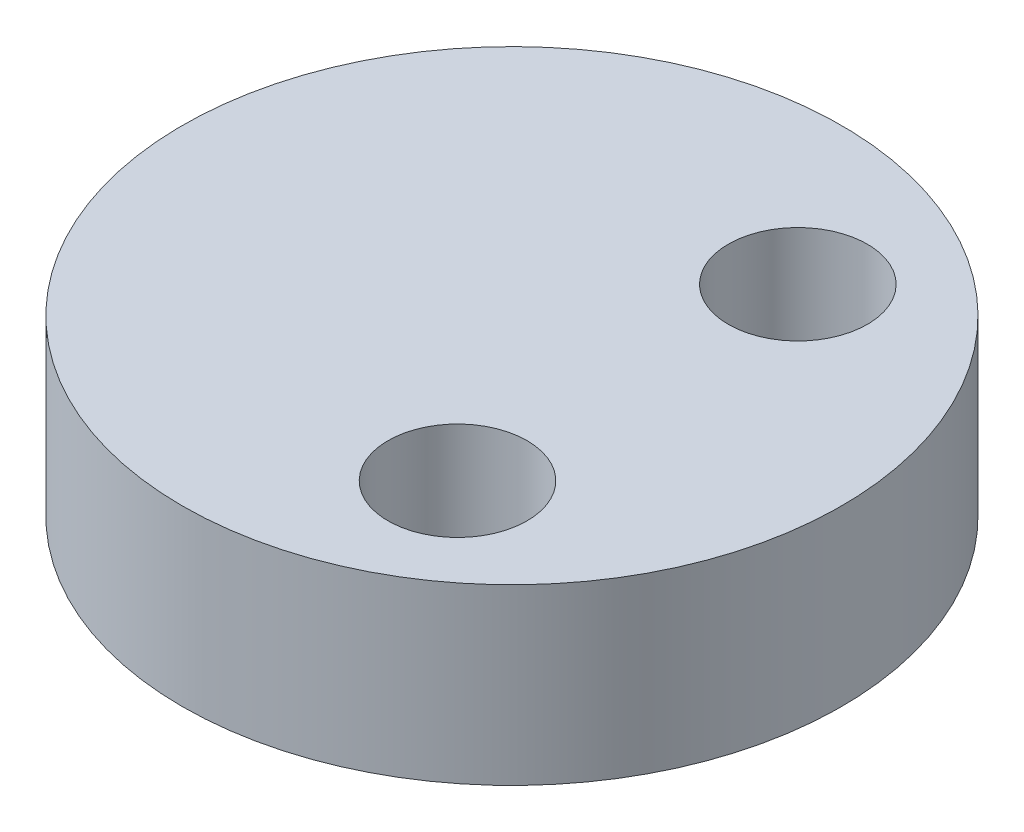
ISO-10303-21;
HEADER;
FILE_DESCRIPTION(('STEP AP214'),'2;1');
FILE_NAME('part.step','',(''),(''),'','','');
FILE_SCHEMA(('AUTOMOTIVE_DESIGN { 1 0 10303 214 1 1 1 1 }'));
ENDSEC;
DATA;
#1=APPLICATION_CONTEXT('core data for automotive mechanical design processes');
#2=APPLICATION_PROTOCOL_DEFINITION('international standard','automotive_design',2000,#1);
#3=PRODUCT_CONTEXT('',#1,'mechanical');
#4=PRODUCT('Part','Part','',(#3));
#5=PRODUCT_RELATED_PRODUCT_CATEGORY('part','',(#4));
#6=PRODUCT_DEFINITION_FORMATION('','',#4);
#7=PRODUCT_DEFINITION_CONTEXT('part definition',#1,'design');
#8=PRODUCT_DEFINITION('design','',#6,#7);
#9=PRODUCT_DEFINITION_SHAPE('','',#8);
#10=(LENGTH_UNIT() NAMED_UNIT(*) SI_UNIT(.MILLI.,.METRE.));
#11=(NAMED_UNIT(*) PLANE_ANGLE_UNIT() SI_UNIT($,.RADIAN.));
#12=(NAMED_UNIT(*) SI_UNIT($,.STERADIAN.) SOLID_ANGLE_UNIT());
#13=UNCERTAINTY_MEASURE_WITH_UNIT(LENGTH_MEASURE(1.E-05),#10,'distance_accuracy_value','');
#14=(GEOMETRIC_REPRESENTATION_CONTEXT(3) GLOBAL_UNCERTAINTY_ASSIGNED_CONTEXT((#13)) GLOBAL_UNIT_ASSIGNED_CONTEXT((#10,
#11,#12)) REPRESENTATION_CONTEXT('',''));
#15=CARTESIAN_POINT('',(0.,0.,0.));
#16=DIRECTION('',(0.,0.,1.));
#17=DIRECTION('',(1.,0.,0.));
#18=AXIS2_PLACEMENT_3D('',#15,#16,#17);
#19=CARTESIAN_POINT('',(0.,-5.,0.));
#20=DIRECTION('',(0.,1.,0.));
#21=DIRECTION('',(0.,0.,1.));
#22=AXIS2_PLACEMENT_3D('',#19,#20,#21);
#23=CYLINDRICAL_SURFACE('',#22,9.48);
#24=CARTESIAN_POINT('',(0.,-5.,0.));
#25=DIRECTION('',(0.,1.,0.));
#26=DIRECTION('',(0.,0.,1.));
#27=AXIS2_PLACEMENT_3D('',#24,#25,#26);
#28=CIRCLE('',#27,9.48);
#29=CARTESIAN_POINT('',(0.,-5.,9.48));
#30=VERTEX_POINT('',#29);
#31=EDGE_CURVE('E10',#30,#30,#28,.T.);
#32=ORIENTED_EDGE('',*,*,#31,.T.);
#33=EDGE_LOOP('',(#32));
#34=FACE_BOUND('',#33,.T.);
#35=CARTESIAN_POINT('',(0.,0.,0.));
#36=DIRECTION('',(0.,1.,0.));
#37=DIRECTION('',(0.,0.,1.));
#38=AXIS2_PLACEMENT_3D('',#35,#36,#37);
#39=CIRCLE('',#38,9.48);
#40=CARTESIAN_POINT('',(0.,0.,9.48));
#41=VERTEX_POINT('',#40);
#42=EDGE_CURVE('E35',#41,#41,#39,.T.);
#43=ORIENTED_EDGE('',*,*,#42,.F.);
#44=EDGE_LOOP('',(#43));
#45=FACE_BOUND('',#44,.T.);
#46=ADVANCED_FACE('F32',(#34,#45),#23,.T.);
#47=CARTESIAN_POINT('',(0.,-5.,0.));
#48=DIRECTION('',(0.,1.,0.));
#49=DIRECTION('',(0.,0.,1.));
#50=AXIS2_PLACEMENT_3D('',#47,#48,#49);
#51=PLANE('',#50);
#52=ORIENTED_EDGE('',*,*,#31,.F.);
#53=EDGE_LOOP('',(#52));
#54=FACE_BOUND('',#53,.T.);
#55=ADVANCED_FACE('F69',(#54),#51,.F.);
#56=CARTESIAN_POINT('',(0.,0.,0.));
#57=DIRECTION('',(0.,1.,0.));
#58=DIRECTION('',(0.,0.,1.));
#59=AXIS2_PLACEMENT_3D('',#56,#57,#58);
#60=PLANE('',#59);
#61=CARTESIAN_POINT('',(3.32928511437673,0.,4.89447850593576));
#62=DIRECTION('',(0.,1.,0.));
#63=DIRECTION('',(0.,0.,-1.));
#64=AXIS2_PLACEMENT_3D('',#61,#62,#63);
#65=CIRCLE('',#64,2.);
#66=CARTESIAN_POINT('',(3.32928511437673,0.,2.89447850593576));
#67=VERTEX_POINT('',#66);
#68=EDGE_CURVE('E50',#67,#67,#65,.T.);
#69=ORIENTED_EDGE('',*,*,#68,.F.);
#70=EDGE_LOOP('',(#69));
#71=FACE_BOUND('',#70,.T.);
#72=CARTESIAN_POINT('',(3.32928511437674,0.,-4.89447850593576));
#73=DIRECTION('',(0.,1.,0.));
#74=DIRECTION('',(0.,0.,1.));
#75=AXIS2_PLACEMENT_3D('',#72,#73,#74);
#76=CIRCLE('',#75,2.);
#77=CARTESIAN_POINT('',(3.32928511437674,0.,-2.89447850593576));
#78=VERTEX_POINT('',#77);
#79=EDGE_CURVE('E44',#78,#78,#76,.T.);
#80=ORIENTED_EDGE('',*,*,#79,.F.);
#81=EDGE_LOOP('',(#80));
#82=FACE_BOUND('',#81,.T.);
#83=ORIENTED_EDGE('',*,*,#42,.T.);
#84=EDGE_LOOP('',(#83));
#85=FACE_BOUND('',#84,.T.);
#86=ADVANCED_FACE('F65',(#71,#82,#85),#60,.T.);
#87=CARTESIAN_POINT('',(3.32928511437674,-3.,-4.89447850593576));
#88=DIRECTION('',(0.,1.,0.));
#89=DIRECTION('',(0.,0.,1.));
#90=AXIS2_PLACEMENT_3D('',#87,#88,#89);
#91=CYLINDRICAL_SURFACE('',#90,2.);
#92=CARTESIAN_POINT('',(3.32928511437674,-3.,-4.89447850593576));
#93=DIRECTION('',(0.,1.,0.));
#94=DIRECTION('',(0.,0.,1.));
#95=AXIS2_PLACEMENT_3D('',#92,#93,#94);
#96=CIRCLE('',#95,2.);
#97=CARTESIAN_POINT('',(3.32928511437674,-3.,-2.89447850593576));
#98=VERTEX_POINT('',#97);
#99=EDGE_CURVE('E42',#98,#98,#96,.T.);
#100=ORIENTED_EDGE('',*,*,#99,.F.);
#101=EDGE_LOOP('',(#100));
#102=FACE_BOUND('',#101,.T.);
#103=ORIENTED_EDGE('',*,*,#79,.T.);
#104=EDGE_LOOP('',(#103));
#105=FACE_BOUND('',#104,.T.);
#106=ADVANCED_FACE('F68',(#102,#105),#91,.F.);
#107=CARTESIAN_POINT('',(3.32928511437674,-3.,-4.89447850593576));
#108=DIRECTION('',(0.,1.,0.));
#109=DIRECTION('',(0.,0.,1.));
#110=AXIS2_PLACEMENT_3D('',#107,#108,#109);
#111=PLANE('',#110);
#112=ORIENTED_EDGE('',*,*,#99,.T.);
#113=EDGE_LOOP('',(#112));
#114=FACE_BOUND('',#113,.T.);
#115=ADVANCED_FACE('F61',(#114),#111,.T.);
#116=CARTESIAN_POINT('',(3.32928511437673,-3.,4.89447850593576));
#117=DIRECTION('',(0.,1.,0.));
#118=DIRECTION('',(0.,0.,1.));
#119=AXIS2_PLACEMENT_3D('',#116,#117,#118);
#120=CYLINDRICAL_SURFACE('',#119,2.);
#121=CARTESIAN_POINT('',(3.32928511437673,-3.,4.89447850593576));
#122=DIRECTION('',(0.,1.,0.));
#123=DIRECTION('',(0.,0.,-1.));
#124=AXIS2_PLACEMENT_3D('',#121,#122,#123);
#125=CIRCLE('',#124,2.);
#126=CARTESIAN_POINT('',(3.32928511437673,-3.,2.89447850593576));
#127=VERTEX_POINT('',#126);
#128=EDGE_CURVE('E47',#127,#127,#125,.T.);
#129=ORIENTED_EDGE('',*,*,#128,.F.);
#130=EDGE_LOOP('',(#129));
#131=FACE_BOUND('',#130,.T.);
#132=ORIENTED_EDGE('',*,*,#68,.T.);
#133=EDGE_LOOP('',(#132));
#134=FACE_BOUND('',#133,.T.);
#135=ADVANCED_FACE('F58',(#131,#134),#120,.F.);
#136=CARTESIAN_POINT('',(3.32928511437673,-3.,4.89447850593576));
#137=DIRECTION('',(0.,-1.,0.));
#138=DIRECTION('',(0.,0.,-1.));
#139=AXIS2_PLACEMENT_3D('',#136,#137,#138);
#140=PLANE('',#139);
#141=ORIENTED_EDGE('',*,*,#128,.T.);
#142=EDGE_LOOP('',(#141));
#143=FACE_BOUND('',#142,.T.);
#144=ADVANCED_FACE('F56',(#143),#140,.F.);
#145=CLOSED_SHELL('',(#46,#55,#86,#106,#115,#135,#144));
#146=MANIFOLD_SOLID_BREP('B2',#145);
#147=ADVANCED_BREP_SHAPE_REPRESENTATION('',(#18,#146),#14);
#148=SHAPE_DEFINITION_REPRESENTATION(#9,#147);
ENDSEC;
END-ISO-10303-21;
